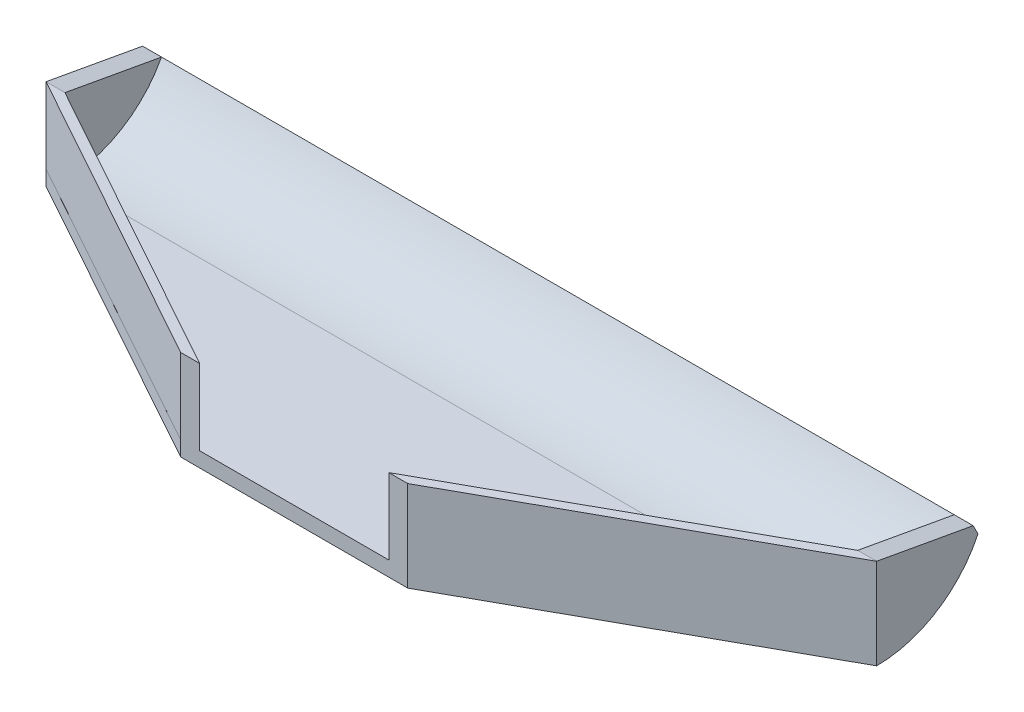
ISO-10303-21;
HEADER;
FILE_DESCRIPTION(('STEP AP214'),'2;1');
FILE_NAME('part.step','',(''),(''),'','','');
FILE_SCHEMA(('AUTOMOTIVE_DESIGN { 1 0 10303 214 1 1 1 1 }'));
ENDSEC;
DATA;
#1=APPLICATION_CONTEXT('core data for automotive mechanical design processes');
#2=APPLICATION_PROTOCOL_DEFINITION('international standard','automotive_design',2000,#1);
#3=PRODUCT_CONTEXT('',#1,'mechanical');
#4=PRODUCT('Part','Part','',(#3));
#5=PRODUCT_RELATED_PRODUCT_CATEGORY('part','',(#4));
#6=PRODUCT_DEFINITION_FORMATION('','',#4);
#7=PRODUCT_DEFINITION_CONTEXT('part definition',#1,'design');
#8=PRODUCT_DEFINITION('design','',#6,#7);
#9=PRODUCT_DEFINITION_SHAPE('','',#8);
#10=(LENGTH_UNIT() NAMED_UNIT(*) SI_UNIT(.MILLI.,.METRE.));
#11=(NAMED_UNIT(*) PLANE_ANGLE_UNIT() SI_UNIT($,.RADIAN.));
#12=(NAMED_UNIT(*) SI_UNIT($,.STERADIAN.) SOLID_ANGLE_UNIT());
#13=UNCERTAINTY_MEASURE_WITH_UNIT(LENGTH_MEASURE(1.E-05),#10,'distance_accuracy_value','');
#14=(GEOMETRIC_REPRESENTATION_CONTEXT(3) GLOBAL_UNCERTAINTY_ASSIGNED_CONTEXT((#13)) GLOBAL_UNIT_ASSIGNED_CONTEXT((#10,
#11,#12)) REPRESENTATION_CONTEXT('',''));
#15=CARTESIAN_POINT('',(0.,0.,0.));
#16=DIRECTION('',(0.,0.,1.));
#17=DIRECTION('',(1.,0.,0.));
#18=AXIS2_PLACEMENT_3D('',#15,#16,#17);
#19=CARTESIAN_POINT('',(1317.1,95.9657129094382,160.824878807552));
#20=DIRECTION('',(-1.,0.,0.));
#21=DIRECTION('',(0.,0.,1.));
#22=AXIS2_PLACEMENT_3D('',#19,#20,#21);
#23=CYLINDRICAL_SURFACE('',#22,173.263299321572);
#24=CARTESIAN_POINT('',(1287.1,95.9657129094423,160.824878807555));
#25=DIRECTION('',(1.,0.,0.));
#26=DIRECTION('',(0.,0.,-1.));
#27=AXIS2_PLACEMENT_3D('',#24,#25,#26);
#28=CIRCLE('',#27,173.263299321577);
#29=CARTESIAN_POINT('',(1287.1,-77.2975864121342,160.824878807552));
#30=VERTEX_POINT('',#29);
#31=CARTESIAN_POINT('',(1287.1,15.,7.64288174241652));
#32=VERTEX_POINT('',#31);
#33=EDGE_CURVE('E156',#30,#32,#28,.T.);
#34=ORIENTED_EDGE('',*,*,#33,.T.);
#35=DIRECTION('',(-1.,0.,0.));
#36=VECTOR('',#35,1.);
#37=CARTESIAN_POINT('',(1317.1,15.,7.64288174241652));
#38=LINE('',#37,#36);
#39=CARTESIAN_POINT('',(30.,15.,7.64288174241652));
#40=VERTEX_POINT('',#39);
#41=EDGE_CURVE('E152',#32,#40,#38,.T.);
#42=ORIENTED_EDGE('',*,*,#41,.T.);
#43=CARTESIAN_POINT('',(30.,95.9657129094425,160.824878807555));
#44=DIRECTION('',(1.,0.,0.));
#45=DIRECTION('',(0.,0.,1.));
#46=AXIS2_PLACEMENT_3D('',#43,#44,#45);
#47=CIRCLE('',#46,173.263299321577);
#48=CARTESIAN_POINT('',(30.,-77.2975864121342,160.824878807552));
#49=VERTEX_POINT('',#48);
#50=EDGE_CURVE('E264',#49,#40,#47,.T.);
#51=ORIENTED_EDGE('',*,*,#50,.F.);
#52=DIRECTION('',(-1.,0.,0.));
#53=VECTOR('',#52,1.);
#54=CARTESIAN_POINT('',(30.1,-77.2975864121342,160.824878807552));
#55=LINE('',#54,#53);
#56=CARTESIAN_POINT('',(30.1,-77.2975864121342,160.824878807552));
#57=VERTEX_POINT('',#56);
#58=EDGE_CURVE('E56',#57,#49,#55,.T.);
#59=ORIENTED_EDGE('',*,*,#58,.F.);
#60=DIRECTION('',(-1.,0.,0.));
#61=VECTOR('',#60,1.);
#62=CARTESIAN_POINT('',(1317.1,-77.2975864121342,160.824878807552));
#63=LINE('',#62,#61);
#64=EDGE_CURVE('E163',#30,#57,#63,.T.);
#65=ORIENTED_EDGE('',*,*,#64,.F.);
#66=EDGE_LOOP('',(#34,#42,#51,#59,#65));
#67=FACE_BOUND('',#66,.T.);
#68=ADVANCED_FACE('F33',(#67),#23,.F.);
#69=CARTESIAN_POINT('',(30.1,42.7024135878658,160.824878807552));
#70=DIRECTION('',(0.,0.,1.));
#71=DIRECTION('',(1.,0.,0.));
#72=AXIS2_PLACEMENT_3D('',#69,#70,#71);
#73=PLANE('',#72);
#74=DIRECTION('',(0.,-1.,0.));
#75=VECTOR('',#74,1.);
#76=CARTESIAN_POINT('',(30.,42.7024135878658,160.824878807552));
#77=LINE('',#76,#75);
#78=CARTESIAN_POINT('',(30.,42.7024135878658,160.824878807552));
#79=VERTEX_POINT('',#78);
#80=EDGE_CURVE('E267',#79,#49,#77,.T.);
#81=ORIENTED_EDGE('',*,*,#80,.F.);
#82=DIRECTION('',(-1.,0.,0.));
#83=VECTOR('',#82,1.);
#84=CARTESIAN_POINT('',(30.1,42.7024135878658,160.824878807552));
#85=LINE('',#84,#83);
#86=CARTESIAN_POINT('',(30.1,42.7024135878658,160.824878807552));
#87=VERTEX_POINT('',#86);
#88=EDGE_CURVE('E242',#87,#79,#85,.T.);
#89=ORIENTED_EDGE('',*,*,#88,.F.);
#90=DIRECTION('',(0.,-1.,0.));
#91=VECTOR('',#90,1.);
#92=CARTESIAN_POINT('',(30.1,42.7024135878658,160.824878807552));
#93=LINE('',#92,#91);
#94=EDGE_CURVE('E236',#87,#57,#93,.T.);
#95=ORIENTED_EDGE('',*,*,#94,.T.);
#96=ORIENTED_EDGE('',*,*,#58,.T.);
#97=EDGE_LOOP('',(#81,#89,#95,#96));
#98=FACE_BOUND('',#97,.T.);
#99=ADVANCED_FACE('F317',(#98),#73,.F.);
#100=CARTESIAN_POINT('',(1317.1,-77.2975864121342,160.824878807552));
#101=DIRECTION('',(0.,-1.,0.));
#102=DIRECTION('',(0.,0.,-1.));
#103=AXIS2_PLACEMENT_3D('',#100,#101,#102);
#104=PLANE('',#103);
#105=DIRECTION('',(0.874828915707659,0.,0.484432005798297));
#106=VECTOR('',#105,1.);
#107=CARTESIAN_POINT('',(478.6,-77.2975864121342,425.791789037056));
#108=LINE('',#107,#106);
#109=CARTESIAN_POINT('',(0.099999999999989,-77.2975864121342,160.824878807552));
#110=VERTEX_POINT('',#109);
#111=CARTESIAN_POINT('',(478.6,-77.2975864121342,425.791789037056));
#112=VERTEX_POINT('',#111);
#113=EDGE_CURVE('E246',#110,#112,#108,.T.);
#114=ORIENTED_EDGE('',*,*,#113,.F.);
#115=CARTESIAN_POINT('',(0.,-77.2975864121342,160.824878807552));
#116=VERTEX_POINT('',#115);
#117=EDGE_CURVE('E170',#110,#116,#63,.T.);
#118=ORIENTED_EDGE('',*,*,#117,.T.);
#119=DIRECTION('',(-0.874871810311313,0.,-0.484354534945845));
#120=VECTOR('',#119,1.);
#121=CARTESIAN_POINT('',(-68.1492414624944,-77.2975864121342,123.095472320294));
#122=LINE('',#121,#120);
#123=EDGE_CURVE('E202',#112,#116,#122,.T.);
#124=ORIENTED_EDGE('',*,*,#123,.F.);
#125=EDGE_LOOP('',(#114,#118,#124));
#126=FACE_BOUND('',#125,.T.);
#127=ADVANCED_FACE('F298',(#126),#104,.F.);
#128=DIRECTION('',(-0.874828915707659,0.,-0.484432005798297));
#129=VECTOR('',#128,1.);
#130=CARTESIAN_POINT('',(508.6,-77.2975864121342,425.791789037056));
#131=LINE('',#130,#129);
#132=CARTESIAN_POINT('',(508.6,-77.2975864121342,425.791789037056));
#133=VERTEX_POINT('',#132);
#134=EDGE_CURVE('E48',#133,#57,#131,.T.);
#135=ORIENTED_EDGE('',*,*,#134,.F.);
#136=DIRECTION('',(-1.,0.,0.));
#137=VECTOR('',#136,1.);
#138=CARTESIAN_POINT('',(1317.1,-77.2975864121342,425.791789037056));
#139=LINE('',#138,#137);
#140=CARTESIAN_POINT('',(808.6,-77.2975864121342,425.791789037056));
#141=VERTEX_POINT('',#140);
#142=EDGE_CURVE('E174',#141,#133,#139,.T.);
#143=ORIENTED_EDGE('',*,*,#142,.F.);
#144=DIRECTION('',(-0.874828915707659,0.,0.484432005798297));
#145=VECTOR('',#144,1.);
#146=CARTESIAN_POINT('',(808.6,-77.2975864121342,425.791789037056));
#147=LINE('',#146,#145);
#148=EDGE_CURVE('E218',#30,#141,#147,.T.);
#149=ORIENTED_EDGE('',*,*,#148,.F.);
#150=ORIENTED_EDGE('',*,*,#64,.T.);
#151=EDGE_LOOP('',(#135,#143,#149,#150));
#152=FACE_BOUND('',#151,.T.);
#153=ADVANCED_FACE('F327',(#152),#104,.F.);
#154=CARTESIAN_POINT('',(1317.1,-100.950379885614,425.791789037056));
#155=DIRECTION('',(0.,0.,-1.));
#156=DIRECTION('',(-1.,0.,0.));
#157=AXIS2_PLACEMENT_3D('',#154,#155,#156);
#158=PLANE('',#157);
#159=DIRECTION('',(0.,1.,0.));
#160=VECTOR('',#159,1.);
#161=CARTESIAN_POINT('',(838.6,-100.950379885614,425.791789037056));
#162=LINE('',#161,#160);
#163=CARTESIAN_POINT('',(838.6,-100.950379885614,425.791789037056));
#164=VERTEX_POINT('',#163);
#165=CARTESIAN_POINT('',(838.6,42.7024135878658,425.791789037056));
#166=VERTEX_POINT('',#165);
#167=EDGE_CURVE('E197',#164,#166,#162,.T.);
#168=ORIENTED_EDGE('',*,*,#167,.T.);
#169=DIRECTION('',(1.,0.,0.));
#170=VECTOR('',#169,1.);
#171=CARTESIAN_POINT('',(838.6,42.7024135878658,425.791789037056));
#172=LINE('',#171,#170);
#173=CARTESIAN_POINT('',(808.6,42.7024135878658,425.791789037056));
#174=VERTEX_POINT('',#173);
#175=EDGE_CURVE('E217',#174,#166,#172,.T.);
#176=ORIENTED_EDGE('',*,*,#175,.F.);
#177=DIRECTION('',(0.,-1.,0.));
#178=VECTOR('',#177,1.);
#179=CARTESIAN_POINT('',(808.6,42.7024135878658,425.791789037056));
#180=LINE('',#179,#178);
#181=EDGE_CURVE('E214',#174,#141,#180,.T.);
#182=ORIENTED_EDGE('',*,*,#181,.T.);
#183=ORIENTED_EDGE('',*,*,#142,.T.);
#184=DIRECTION('',(0.,-1.,0.));
#185=VECTOR('',#184,1.);
#186=CARTESIAN_POINT('',(508.6,42.7024135878658,425.791789037056));
#187=LINE('',#186,#185);
#188=CARTESIAN_POINT('',(508.6,42.7024135878658,425.791789037056));
#189=VERTEX_POINT('',#188);
#190=EDGE_CURVE('E233',#189,#133,#187,.T.);
#191=ORIENTED_EDGE('',*,*,#190,.F.);
#192=DIRECTION('',(1.,0.,0.));
#193=VECTOR('',#192,1.);
#194=CARTESIAN_POINT('',(478.6,42.7024135878658,425.791789037056));
#195=LINE('',#194,#193);
#196=CARTESIAN_POINT('',(478.6,42.7024135878658,425.791789037056));
#197=VERTEX_POINT('',#196);
#198=EDGE_CURVE('E253',#197,#189,#195,.T.);
#199=ORIENTED_EDGE('',*,*,#198,.F.);
#200=DIRECTION('',(0.,-1.,0.));
#201=VECTOR('',#200,1.);
#202=CARTESIAN_POINT('',(478.6,42.7024135878658,425.791789037056));
#203=LINE('',#202,#201);
#204=EDGE_CURVE('E222',#197,#112,#203,.T.);
#205=ORIENTED_EDGE('',*,*,#204,.T.);
#206=DIRECTION('',(0.,1.,0.));
#207=VECTOR('',#206,1.);
#208=CARTESIAN_POINT('',(478.6,-100.950379885614,425.791789037056));
#209=LINE('',#208,#207);
#210=CARTESIAN_POINT('',(478.6,-100.950379885614,425.791789037056));
#211=VERTEX_POINT('',#210);
#212=EDGE_CURVE('E204',#211,#112,#209,.T.);
#213=ORIENTED_EDGE('',*,*,#212,.F.);
#214=DIRECTION('',(-1.,0.,0.));
#215=VECTOR('',#214,1.);
#216=CARTESIAN_POINT('',(1317.1,-100.950379885614,425.791789037056));
#217=LINE('',#216,#215);
#218=EDGE_CURVE('E176',#164,#211,#217,.T.);
#219=ORIENTED_EDGE('',*,*,#218,.F.);
#220=EDGE_LOOP('',(#168,#176,#182,#183,#191,#199,#205,#213,#219));
#221=FACE_BOUND('',#220,.T.);
#222=ADVANCED_FACE('F291',(#221),#158,.F.);
#223=CARTESIAN_POINT('',(1317.1,-100.950379885614,159.891789037057));
#224=DIRECTION('',(0.,1.,0.));
#225=DIRECTION('',(0.,0.,1.));
#226=AXIS2_PLACEMENT_3D('',#223,#224,#225);
#227=PLANE('',#226);
#228=ORIENTED_EDGE('',*,*,#218,.T.);
#229=DIRECTION('',(-0.874871810311313,0.,-0.484354534945845));
#230=VECTOR('',#229,1.);
#231=CARTESIAN_POINT('',(-68.1492414624944,-100.950379885614,123.095472320294));
#232=LINE('',#231,#230);
#233=CARTESIAN_POINT('',(0.,-100.950379885614,160.824878807552));
#234=VERTEX_POINT('',#233);
#235=EDGE_CURVE('E206',#211,#234,#232,.T.);
#236=ORIENTED_EDGE('',*,*,#235,.T.);
#237=DIRECTION('',(0.,0.,-1.));
#238=VECTOR('',#237,1.);
#239=CARTESIAN_POINT('',(0.,-100.950379885614,159.891789037057));
#240=LINE('',#239,#238);
#241=CARTESIAN_POINT('',(0.,-100.950379885614,159.891789037057));
#242=VERTEX_POINT('',#241);
#243=EDGE_CURVE('E183',#234,#242,#240,.T.);
#244=ORIENTED_EDGE('',*,*,#243,.T.);
#245=DIRECTION('',(-1.,0.,0.));
#246=VECTOR('',#245,1.);
#247=CARTESIAN_POINT('',(1317.1,-100.950379885614,159.891789037057));
#248=LINE('',#247,#246);
#249=CARTESIAN_POINT('',(1317.1,-100.950379885614,159.891789037057));
#250=VERTEX_POINT('',#249);
#251=EDGE_CURVE('E179',#250,#242,#248,.T.);
#252=ORIENTED_EDGE('',*,*,#251,.F.);
#253=DIRECTION('',(0.,0.,-1.));
#254=VECTOR('',#253,1.);
#255=CARTESIAN_POINT('',(1317.1,-100.950379885614,159.891789037057));
#256=LINE('',#255,#254);
#257=CARTESIAN_POINT('',(1317.1,-100.950379885614,160.824878807552));
#258=VERTEX_POINT('',#257);
#259=EDGE_CURVE('E182',#258,#250,#256,.T.);
#260=ORIENTED_EDGE('',*,*,#259,.F.);
#261=DIRECTION('',(0.874828915707659,0.,-0.484432005798297));
#262=VECTOR('',#261,1.);
#263=CARTESIAN_POINT('',(377.246410248366,-100.950379885614,681.263962913295));
#264=LINE('',#263,#262);
#265=EDGE_CURVE('E200',#164,#258,#264,.T.);
#266=ORIENTED_EDGE('',*,*,#265,.F.);
#267=EDGE_LOOP('',(#228,#236,#244,#252,#260,#266));
#268=FACE_BOUND('',#267,.T.);
#269=ADVANCED_FACE('F287',(#268),#227,.F.);
#270=CARTESIAN_POINT('',(1317.1,76.1483266325561,159.891789037056));
#271=DIRECTION('',(-1.,0.,0.));
#272=DIRECTION('',(0.,0.,1.));
#273=AXIS2_PLACEMENT_3D('',#270,#271,#272);
#274=PLANE('',#273);
#275=DIRECTION('',(0.,1.,0.));
#276=VECTOR('',#275,1.);
#277=CARTESIAN_POINT('',(1317.1,-100.950379885614,160.824878807552));
#278=LINE('',#277,#276);
#279=CARTESIAN_POINT('',(1317.1,42.7024135878658,160.824878807552));
#280=VERTEX_POINT('',#279);
#281=EDGE_CURVE('E199',#258,#280,#278,.T.);
#282=ORIENTED_EDGE('',*,*,#281,.F.);
#283=ORIENTED_EDGE('',*,*,#259,.T.);
#284=CARTESIAN_POINT('',(1317.1,76.1483266325561,159.891789037056));
#285=DIRECTION('',(1.,0.,0.));
#286=DIRECTION('',(0.,0.,1.));
#287=AXIS2_PLACEMENT_3D('',#284,#285,#286);
#288=CIRCLE('',#287,177.09870651817);
#289=CARTESIAN_POINT('',(1317.1,0.,0.));
#290=VERTEX_POINT('',#289);
#291=EDGE_CURVE('E185',#250,#290,#288,.T.);
#292=ORIENTED_EDGE('',*,*,#291,.T.);
#293=DIRECTION('',(0.,0.891006524188366,0.453990499739551));
#294=VECTOR('',#293,1.);
#295=CARTESIAN_POINT('',(1317.1,0.,0.));
#296=LINE('',#295,#294);
#297=CARTESIAN_POINT('',(1317.1,15.,7.64288174241652));
#298=VERTEX_POINT('',#297);
#299=EDGE_CURVE('E193',#290,#298,#296,.T.);
#300=ORIENTED_EDGE('',*,*,#299,.T.);
#301=DIRECTION('',(0.,0.177959695081288,0.984037777184685));
#302=VECTOR('',#301,1.);
#303=CARTESIAN_POINT('',(1317.1,15.,7.64288174241652));
#304=LINE('',#303,#302);
#305=EDGE_CURVE('E148',#298,#280,#304,.T.);
#306=ORIENTED_EDGE('',*,*,#305,.T.);
#307=EDGE_LOOP('',(#282,#283,#292,#300,#306));
#308=FACE_BOUND('',#307,.T.);
#309=ADVANCED_FACE('F275',(#308),#274,.F.);
#310=CARTESIAN_POINT('',(1317.1,76.1483266325561,159.891789037056));
#311=DIRECTION('',(-1.,0.,0.));
#312=DIRECTION('',(0.,0.,1.));
#313=AXIS2_PLACEMENT_3D('',#310,#311,#312);
#314=CYLINDRICAL_SURFACE('',#313,177.09870651817);
#315=CARTESIAN_POINT('',(0.,76.1483266325561,159.891789037056));
#316=DIRECTION('',(1.,0.,0.));
#317=DIRECTION('',(0.,0.,1.));
#318=AXIS2_PLACEMENT_3D('',#315,#316,#317);
#319=CIRCLE('',#318,177.09870651817);
#320=CARTESIAN_POINT('',(0.,0.,0.));
#321=VERTEX_POINT('',#320);
#322=EDGE_CURVE('E188',#242,#321,#319,.T.);
#323=ORIENTED_EDGE('',*,*,#322,.T.);
#324=DIRECTION('',(-1.,0.,0.));
#325=VECTOR('',#324,1.);
#326=CARTESIAN_POINT('',(1317.1,0.,0.));
#327=LINE('',#326,#325);
#328=EDGE_CURVE('E11',#290,#321,#327,.T.);
#329=ORIENTED_EDGE('',*,*,#328,.F.);
#330=ORIENTED_EDGE('',*,*,#291,.F.);
#331=ORIENTED_EDGE('',*,*,#251,.T.);
#332=EDGE_LOOP('',(#323,#329,#330,#331));
#333=FACE_BOUND('',#332,.T.);
#334=ADVANCED_FACE('F35',(#333),#314,.T.);
#335=CARTESIAN_POINT('',(1317.1,0.,0.));
#336=DIRECTION('',(0.,-0.453990499739551,0.891006524188366));
#337=DIRECTION('',(0.,-0.891006524188366,-0.453990499739551));
#338=AXIS2_PLACEMENT_3D('',#335,#336,#337);
#339=PLANE('',#338);
#340=DIRECTION('',(0.,0.891006524188366,0.453990499739551));
#341=VECTOR('',#340,1.);
#342=CARTESIAN_POINT('',(0.,0.,0.));
#343=LINE('',#342,#341);
#344=CARTESIAN_POINT('',(0.,15.,7.64288174241652));
#345=VERTEX_POINT('',#344);
#346=EDGE_CURVE('E186',#321,#345,#343,.T.);
#347=ORIENTED_EDGE('',*,*,#346,.T.);
#348=DIRECTION('',(-1.,0.,0.));
#349=VECTOR('',#348,1.);
#350=CARTESIAN_POINT('',(30.,15.,7.64288174241652));
#351=LINE('',#350,#349);
#352=EDGE_CURVE('E169',#40,#345,#351,.T.);
#353=ORIENTED_EDGE('',*,*,#352,.F.);
#354=ORIENTED_EDGE('',*,*,#41,.F.);
#355=EDGE_CURVE('E41',#298,#32,#38,.T.);
#356=ORIENTED_EDGE('',*,*,#355,.F.);
#357=ORIENTED_EDGE('',*,*,#299,.F.);
#358=ORIENTED_EDGE('',*,*,#328,.T.);
#359=EDGE_LOOP('',(#347,#353,#354,#356,#357,#358));
#360=FACE_BOUND('',#359,.T.);
#361=ADVANCED_FACE('F167',(#360),#339,.F.);
#362=CARTESIAN_POINT('',(0.,76.1483266325561,159.891789037056));
#363=DIRECTION('',(-1.,0.,0.));
#364=DIRECTION('',(0.,0.,1.));
#365=AXIS2_PLACEMENT_3D('',#362,#363,#364);
#366=PLANE('',#365);
#367=DIRECTION('',(0.,1.,0.));
#368=VECTOR('',#367,1.);
#369=CARTESIAN_POINT('',(0.,-100.950379885614,160.824878807552));
#370=LINE('',#369,#368);
#371=EDGE_CURVE('E191',#234,#116,#370,.T.);
#372=ORIENTED_EDGE('',*,*,#371,.T.);
#373=DIRECTION('',(0.,-1.,0.));
#374=VECTOR('',#373,1.);
#375=CARTESIAN_POINT('',(0.,42.7024135878658,160.824878807552));
#376=LINE('',#375,#374);
#377=CARTESIAN_POINT('',(0.,42.7024135878658,160.824878807552));
#378=VERTEX_POINT('',#377);
#379=EDGE_CURVE('E262',#378,#116,#376,.T.);
#380=ORIENTED_EDGE('',*,*,#379,.F.);
#381=DIRECTION('',(0.,0.177959695081288,0.984037777184685));
#382=VECTOR('',#381,1.);
#383=CARTESIAN_POINT('',(0.,15.,7.64288174241652));
#384=LINE('',#383,#382);
#385=EDGE_CURVE('E160',#345,#378,#384,.T.);
#386=ORIENTED_EDGE('',*,*,#385,.F.);
#387=ORIENTED_EDGE('',*,*,#346,.F.);
#388=ORIENTED_EDGE('',*,*,#322,.F.);
#389=ORIENTED_EDGE('',*,*,#243,.F.);
#390=EDGE_LOOP('',(#372,#380,#386,#387,#388,#389));
#391=FACE_BOUND('',#390,.T.);
#392=ADVANCED_FACE('F304',(#391),#366,.T.);
#393=CARTESIAN_POINT('',(-68.1492414624944,-100.950379885614,123.095472320294));
#394=DIRECTION('',(0.484354534945845,0.,-0.874871810311313));
#395=DIRECTION('',(-0.874871810311313,0.,-0.484354534945845));
#396=AXIS2_PLACEMENT_3D('',#393,#394,#395);
#397=PLANE('',#396);
#398=ORIENTED_EDGE('',*,*,#123,.T.);
#399=ORIENTED_EDGE('',*,*,#371,.F.);
#400=ORIENTED_EDGE('',*,*,#235,.F.);
#401=ORIENTED_EDGE('',*,*,#212,.T.);
#402=EDGE_LOOP('',(#398,#399,#400,#401));
#403=FACE_BOUND('',#402,.T.);
#404=ADVANCED_FACE('F295',(#403),#397,.F.);
#405=CARTESIAN_POINT('',(377.246410248366,-100.950379885614,681.263962913295));
#406=DIRECTION('',(0.484432005798297,0.,0.874828915707659));
#407=DIRECTION('',(0.874828915707659,0.,-0.484432005798297));
#408=AXIS2_PLACEMENT_3D('',#405,#406,#407);
#409=PLANE('',#408);
#410=ORIENTED_EDGE('',*,*,#281,.T.);
#411=DIRECTION('',(0.874828915707659,0.,-0.484432005798297));
#412=VECTOR('',#411,1.);
#413=CARTESIAN_POINT('',(838.6,42.7024135878658,425.791789037056));
#414=LINE('',#413,#412);
#415=EDGE_CURVE('E221',#166,#280,#414,.T.);
#416=ORIENTED_EDGE('',*,*,#415,.F.);
#417=ORIENTED_EDGE('',*,*,#167,.F.);
#418=ORIENTED_EDGE('',*,*,#265,.T.);
#419=EDGE_LOOP('',(#410,#416,#417,#418));
#420=FACE_BOUND('',#419,.T.);
#421=ADVANCED_FACE('F283',(#420),#409,.T.);
#422=CARTESIAN_POINT('',(808.6,42.7024135878658,425.791789037056));
#423=DIRECTION('',(0.484432005798297,0.,0.874828915707659));
#424=DIRECTION('',(0.874828915707659,0.,-0.484432005798298));
#425=AXIS2_PLACEMENT_3D('',#422,#423,#424);
#426=PLANE('',#425);
#427=ORIENTED_EDGE('',*,*,#148,.T.);
#428=ORIENTED_EDGE('',*,*,#181,.F.);
#429=DIRECTION('',(-0.874828915707659,0.,0.484432005798297));
#430=VECTOR('',#429,1.);
#431=CARTESIAN_POINT('',(808.6,42.7024135878658,425.791789037056));
#432=LINE('',#431,#430);
#433=CARTESIAN_POINT('',(1287.1,42.7024135878658,160.824878807552));
#434=VERTEX_POINT('',#433);
#435=EDGE_CURVE('E225',#434,#174,#432,.T.);
#436=ORIENTED_EDGE('',*,*,#435,.F.);
#437=DIRECTION('',(0.,-1.,0.));
#438=VECTOR('',#437,1.);
#439=CARTESIAN_POINT('',(1287.1,42.7024135878658,160.824878807552));
#440=LINE('',#439,#438);
#441=EDGE_CURVE('E159',#434,#30,#440,.T.);
#442=ORIENTED_EDGE('',*,*,#441,.T.);
#443=EDGE_LOOP('',(#427,#428,#436,#442));
#444=FACE_BOUND('',#443,.T.);
#445=ADVANCED_FACE('F336',(#444),#426,.F.);
#446=CARTESIAN_POINT('',(0.,42.7024135878658,0.));
#447=DIRECTION('',(0.,-1.,0.));
#448=DIRECTION('',(0.,0.,-1.));
#449=AXIS2_PLACEMENT_3D('',#446,#447,#448);
#450=PLANE('',#449);
#451=ORIENTED_EDGE('',*,*,#415,.T.);
#452=DIRECTION('',(-1.,0.,0.));
#453=VECTOR('',#452,1.);
#454=CARTESIAN_POINT('',(1287.1,42.7024135878658,160.824878807552));
#455=LINE('',#454,#453);
#456=EDGE_CURVE('E227',#280,#434,#455,.T.);
#457=ORIENTED_EDGE('',*,*,#456,.T.);
#458=ORIENTED_EDGE('',*,*,#435,.T.);
#459=ORIENTED_EDGE('',*,*,#175,.T.);
#460=EDGE_LOOP('',(#451,#457,#458,#459));
#461=FACE_BOUND('',#460,.T.);
#462=ADVANCED_FACE('F279',(#461),#450,.F.);
#463=CARTESIAN_POINT('',(478.6,42.7024135878658,425.791789037056));
#464=DIRECTION('',(0.484432005798297,0.,-0.874828915707659));
#465=DIRECTION('',(-0.874828915707659,0.,-0.484432005798298));
#466=AXIS2_PLACEMENT_3D('',#463,#464,#465);
#467=PLANE('',#466);
#468=ORIENTED_EDGE('',*,*,#113,.T.);
#469=ORIENTED_EDGE('',*,*,#204,.F.);
#470=DIRECTION('',(0.874828915707659,0.,0.484432005798297));
#471=VECTOR('',#470,1.);
#472=CARTESIAN_POINT('',(478.6,42.7024135878658,425.791789037056));
#473=LINE('',#472,#471);
#474=CARTESIAN_POINT('',(0.099999999999989,42.7024135878658,160.824878807552));
#475=VERTEX_POINT('',#474);
#476=EDGE_CURVE('E244',#475,#197,#473,.T.);
#477=ORIENTED_EDGE('',*,*,#476,.F.);
#478=DIRECTION('',(0.,-1.,0.));
#479=VECTOR('',#478,1.);
#480=CARTESIAN_POINT('',(0.099999999999989,42.7024135878658,160.824878807552));
#481=LINE('',#480,#479);
#482=EDGE_CURVE('E239',#475,#110,#481,.T.);
#483=ORIENTED_EDGE('',*,*,#482,.T.);
#484=EDGE_LOOP('',(#468,#469,#477,#483));
#485=FACE_BOUND('',#484,.T.);
#486=ADVANCED_FACE('F344',(#485),#467,.F.);
#487=CARTESIAN_POINT('',(508.6,42.7024135878658,425.791789037056));
#488=DIRECTION('',(-0.484432005798297,0.,0.874828915707659));
#489=DIRECTION('',(0.874828915707659,0.,0.484432005798298));
#490=AXIS2_PLACEMENT_3D('',#487,#488,#489);
#491=PLANE('',#490);
#492=ORIENTED_EDGE('',*,*,#134,.T.);
#493=ORIENTED_EDGE('',*,*,#94,.F.);
#494=DIRECTION('',(-0.874828915707659,0.,-0.484432005798297));
#495=VECTOR('',#494,1.);
#496=CARTESIAN_POINT('',(508.6,42.7024135878658,425.791789037056));
#497=LINE('',#496,#495);
#498=EDGE_CURVE('E251',#189,#87,#497,.T.);
#499=ORIENTED_EDGE('',*,*,#498,.F.);
#500=ORIENTED_EDGE('',*,*,#190,.T.);
#501=EDGE_LOOP('',(#492,#493,#499,#500));
#502=FACE_BOUND('',#501,.T.);
#503=ADVANCED_FACE('F347',(#502),#491,.F.);
#504=CARTESIAN_POINT('',(0.,42.7024135878658,0.));
#505=DIRECTION('',(0.,1.,0.));
#506=DIRECTION('',(0.,0.,1.));
#507=AXIS2_PLACEMENT_3D('',#504,#505,#506);
#508=PLANE('',#507);
#509=ORIENTED_EDGE('',*,*,#476,.T.);
#510=ORIENTED_EDGE('',*,*,#198,.T.);
#511=ORIENTED_EDGE('',*,*,#498,.T.);
#512=ORIENTED_EDGE('',*,*,#88,.T.);
#513=DIRECTION('',(-1.,0.,0.));
#514=VECTOR('',#513,1.);
#515=CARTESIAN_POINT('',(30.,42.7024135878658,160.824878807552));
#516=LINE('',#515,#514);
#517=EDGE_CURVE('E258',#79,#475,#516,.T.);
#518=ORIENTED_EDGE('',*,*,#517,.T.);
#519=EDGE_LOOP('',(#509,#510,#511,#512,#518));
#520=FACE_BOUND('',#519,.T.);
#521=ADVANCED_FACE('F350',(#520),#508,.T.);
#522=CARTESIAN_POINT('',(30.,42.7024135878658,160.824878807552));
#523=DIRECTION('',(0.,0.,-1.));
#524=DIRECTION('',(-1.,0.,0.));
#525=AXIS2_PLACEMENT_3D('',#522,#523,#524);
#526=PLANE('',#525);
#527=ORIENTED_EDGE('',*,*,#117,.F.);
#528=ORIENTED_EDGE('',*,*,#482,.F.);
#529=EDGE_CURVE('E261',#475,#378,#516,.T.);
#530=ORIENTED_EDGE('',*,*,#529,.T.);
#531=ORIENTED_EDGE('',*,*,#379,.T.);
#532=EDGE_LOOP('',(#527,#528,#530,#531));
#533=FACE_BOUND('',#532,.T.);
#534=ADVANCED_FACE('F301',(#533),#526,.F.);
#535=CARTESIAN_POINT('',(30.,15.,7.64288174241652));
#536=DIRECTION('',(0.,-0.984037777184685,0.177959695081288));
#537=DIRECTION('',(0.,-0.177959695081288,-0.984037777184685));
#538=AXIS2_PLACEMENT_3D('',#535,#536,#537);
#539=PLANE('',#538);
#540=ORIENTED_EDGE('',*,*,#385,.T.);
#541=ORIENTED_EDGE('',*,*,#529,.F.);
#542=ORIENTED_EDGE('',*,*,#517,.F.);
#543=DIRECTION('',(0.,0.177959695081288,0.984037777184685));
#544=VECTOR('',#543,1.);
#545=CARTESIAN_POINT('',(30.,15.,7.64288174241652));
#546=LINE('',#545,#544);
#547=EDGE_CURVE('E269',#40,#79,#546,.T.);
#548=ORIENTED_EDGE('',*,*,#547,.F.);
#549=ORIENTED_EDGE('',*,*,#352,.T.);
#550=EDGE_LOOP('',(#540,#541,#542,#548,#549));
#551=FACE_BOUND('',#550,.T.);
#552=ADVANCED_FACE('F356',(#551),#539,.F.);
#553=CARTESIAN_POINT('',(30.,95.9657129094425,160.824878807555));
#554=DIRECTION('',(-1.,0.,0.));
#555=DIRECTION('',(0.,0.,1.));
#556=AXIS2_PLACEMENT_3D('',#553,#554,#555);
#557=PLANE('',#556);
#558=ORIENTED_EDGE('',*,*,#50,.T.);
#559=ORIENTED_EDGE('',*,*,#547,.T.);
#560=ORIENTED_EDGE('',*,*,#80,.T.);
#561=EDGE_LOOP('',(#558,#559,#560));
#562=FACE_BOUND('',#561,.T.);
#563=ADVANCED_FACE('F359',(#562),#557,.F.);
#564=CARTESIAN_POINT('',(1287.1,15.,7.64288174241652));
#565=DIRECTION('',(0.,0.984037777184685,-0.177959695081288));
#566=DIRECTION('',(0.,0.177959695081288,0.984037777184685));
#567=AXIS2_PLACEMENT_3D('',#564,#565,#566);
#568=PLANE('',#567);
#569=ORIENTED_EDGE('',*,*,#305,.F.);
#570=ORIENTED_EDGE('',*,*,#355,.T.);
#571=DIRECTION('',(0.,0.177959695081288,0.984037777184685));
#572=VECTOR('',#571,1.);
#573=CARTESIAN_POINT('',(1287.1,15.,7.64288174241652));
#574=LINE('',#573,#572);
#575=EDGE_CURVE('E145',#32,#434,#574,.T.);
#576=ORIENTED_EDGE('',*,*,#575,.T.);
#577=ORIENTED_EDGE('',*,*,#456,.F.);
#578=EDGE_LOOP('',(#569,#570,#576,#577));
#579=FACE_BOUND('',#578,.T.);
#580=ADVANCED_FACE('F143',(#579),#568,.T.);
#581=CARTESIAN_POINT('',(1287.1,95.9657129094423,160.824878807555));
#582=DIRECTION('',(1.,0.,0.));
#583=DIRECTION('',(0.,0.,-1.));
#584=AXIS2_PLACEMENT_3D('',#581,#582,#583);
#585=PLANE('',#584);
#586=ORIENTED_EDGE('',*,*,#33,.F.);
#587=ORIENTED_EDGE('',*,*,#441,.F.);
#588=ORIENTED_EDGE('',*,*,#575,.F.);
#589=EDGE_LOOP('',(#586,#587,#588));
#590=FACE_BOUND('',#589,.T.);
#591=ADVANCED_FACE('F155',(#590),#585,.F.);
#592=CLOSED_SHELL('',(#68,#99,#127,#153,#222,#269,#309,#334,#361,#392,#404,#421,#445,#462,#486,
#503,#521,#534,#552,#563,#580,#591));
#593=MANIFOLD_SOLID_BREP('B2',#592);
#594=ADVANCED_BREP_SHAPE_REPRESENTATION('',(#18,#593),#14);
#595=SHAPE_DEFINITION_REPRESENTATION(#9,#594);
ENDSEC;
END-ISO-10303-21;
